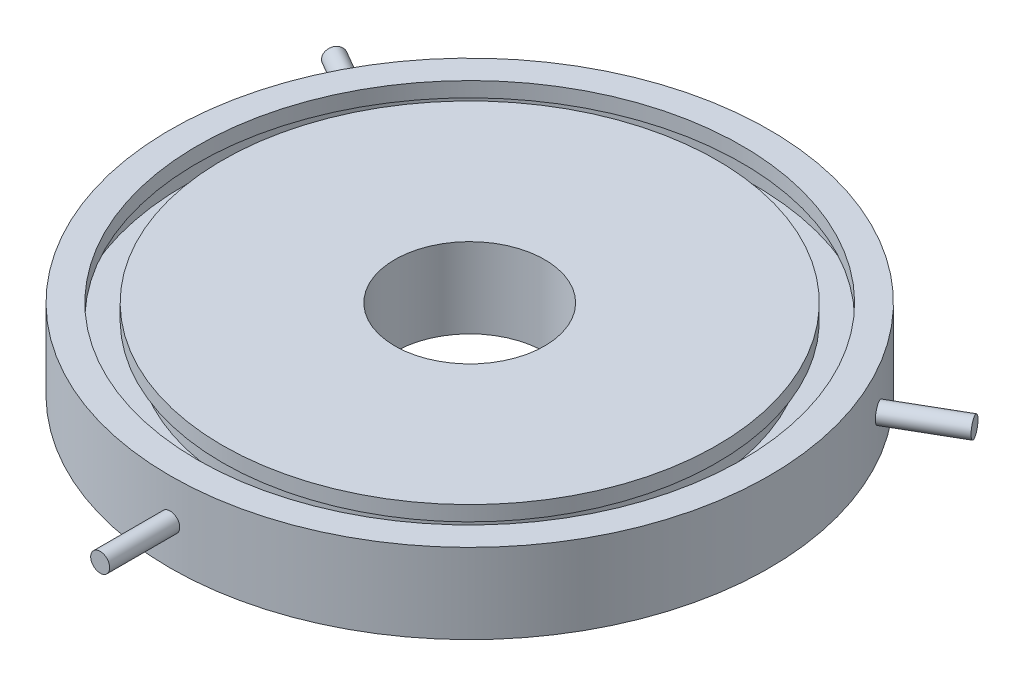
ISO-10303-21;
HEADER;
FILE_DESCRIPTION(('STEP AP214'),'2;1');
FILE_NAME('part.step','',(''),(''),'','','');
FILE_SCHEMA(('AUTOMOTIVE_DESIGN { 1 0 10303 214 1 1 1 1 }'));
ENDSEC;
DATA;
#1=APPLICATION_CONTEXT('core data for automotive mechanical design processes');
#2=APPLICATION_PROTOCOL_DEFINITION('international standard','automotive_design',2000,#1);
#3=PRODUCT_CONTEXT('',#1,'mechanical');
#4=PRODUCT('Part','Part','',(#3));
#5=PRODUCT_RELATED_PRODUCT_CATEGORY('part','',(#4));
#6=PRODUCT_DEFINITION_FORMATION('','',#4);
#7=PRODUCT_DEFINITION_CONTEXT('part definition',#1,'design');
#8=PRODUCT_DEFINITION('design','',#6,#7);
#9=PRODUCT_DEFINITION_SHAPE('','',#8);
#10=(LENGTH_UNIT() NAMED_UNIT(*) SI_UNIT(.MILLI.,.METRE.));
#11=(NAMED_UNIT(*) PLANE_ANGLE_UNIT() SI_UNIT($,.RADIAN.));
#12=(NAMED_UNIT(*) SI_UNIT($,.STERADIAN.) SOLID_ANGLE_UNIT());
#13=UNCERTAINTY_MEASURE_WITH_UNIT(LENGTH_MEASURE(1.E-05),#10,'distance_accuracy_value','');
#14=(GEOMETRIC_REPRESENTATION_CONTEXT(3) GLOBAL_UNCERTAINTY_ASSIGNED_CONTEXT((#13)) GLOBAL_UNIT_ASSIGNED_CONTEXT((#10,
#11,#12)) REPRESENTATION_CONTEXT('',''));
#15=CARTESIAN_POINT('',(0.,0.,0.));
#16=DIRECTION('',(0.,0.,1.));
#17=DIRECTION('',(1.,0.,0.));
#18=AXIS2_PLACEMENT_3D('',#15,#16,#17);
#19=CARTESIAN_POINT('',(-1.09482735377586E-12,4.,-6.34908792207511E-13));
#20=DIRECTION('',(0.,-1.,0.));
#21=DIRECTION('',(0.,0.,-1.));
#22=AXIS2_PLACEMENT_3D('',#19,#20,#21);
#23=CYLINDRICAL_SURFACE('',#22,30.);
#24=CARTESIAN_POINT('',(-1.09482735377586E-12,4.,-6.34908792207511E-13));
#25=DIRECTION('',(0.,1.,0.));
#26=DIRECTION('',(0.,0.,1.));
#27=AXIS2_PLACEMENT_3D('',#24,#25,#26);
#28=CIRCLE('',#27,30.);
#29=CARTESIAN_POINT('',(-1.09482735377586E-12,4.,29.9999999999994));
#30=VERTEX_POINT('',#29);
#31=EDGE_CURVE('E65',#30,#30,#28,.T.);
#32=ORIENTED_EDGE('',*,*,#31,.F.);
#33=EDGE_LOOP('',(#32));
#34=FACE_BOUND('',#33,.T.);
#35=CARTESIAN_POINT('',(-1.09482735377586E-12,-4.,-6.34908792207511E-13));
#36=DIRECTION('',(0.,1.,0.));
#37=DIRECTION('',(0.,0.,1.));
#38=AXIS2_PLACEMENT_3D('',#35,#36,#37);
#39=CIRCLE('',#38,30.);
#40=CARTESIAN_POINT('',(-1.09482735377586E-12,-4.,29.9999999999994));
#41=VERTEX_POINT('',#40);
#42=EDGE_CURVE('E144',#41,#41,#39,.T.);
#43=ORIENTED_EDGE('',*,*,#42,.T.);
#44=EDGE_LOOP('',(#43));
#45=FACE_BOUND('',#44,.T.);
#46=CARTESIAN_POINT('',(-0.95,0.,29.9849545605786));
#47=CARTESIAN_POINT('',(-0.949997638648001,-0.0533475617914222,29.9849547635282));
#48=CARTESIAN_POINT('',(-0.945491291271366,-0.106733465109091,29.9850984594788));
#49=CARTESIAN_POINT('',(-0.927577662957273,-0.212034011387137,29.9856578531794));
#50=CARTESIAN_POINT('',(-0.914159759069934,-0.263946821255327,29.9860738755455));
#51=CARTESIAN_POINT('',(-0.878806261346535,-0.36476046482302,29.9871307482794));
#52=CARTESIAN_POINT('',(-0.856874845689744,-0.413662762374192,29.9877714883475));
#53=CARTESIAN_POINT('',(-0.805122896517256,-0.50707797466031,29.989205457033));
#54=CARTESIAN_POINT('',(-0.775304284731987,-0.551591954995381,29.9899986484924));
#55=CARTESIAN_POINT('',(-0.708607295027484,-0.635002509774153,29.9916485981506));
#56=CARTESIAN_POINT('',(-0.671725971899152,-0.673896728817169,29.9925053827767));
#57=CARTESIAN_POINT('',(-0.591955720063285,-0.744943847642183,29.994185712697));
#58=CARTESIAN_POINT('',(-0.549066551848916,-0.777096478538527,29.9950092566642));
#59=CARTESIAN_POINT('',(-0.458488873293861,-0.833751765511642,29.9965304140593));
#60=CARTESIAN_POINT('',(-0.410799445448349,-0.858252955433277,29.9972280033412));
#61=CARTESIAN_POINT('',(-0.311981505377094,-0.898900338142444,29.9984184028569));
#62=CARTESIAN_POINT('',(-0.260853007724078,-0.915046566330805,29.9989112139584));
#63=CARTESIAN_POINT('',(-0.15662656437145,-0.938520483227959,29.9996363585291));
#64=CARTESIAN_POINT('',(-0.103529290039781,-0.945851150114085,29.9998687799644));
#65=CARTESIAN_POINT('',(0.00314267862065953,-0.951495030277864,30.0000472410445));
#66=CARTESIAN_POINT('',(0.0567173709248461,-0.949808281777499,29.9999932819032));
#67=CARTESIAN_POINT('',(0.162803211517166,-0.937467721948742,29.9996051393655));
#68=CARTESIAN_POINT('',(0.215314734128148,-0.926817124898033,29.9992710564166));
#69=CARTESIAN_POINT('',(0.317804111783429,-0.896856172634715,29.9983604326374));
#70=CARTESIAN_POINT('',(0.367781960932794,-0.877545797274985,29.9977838912429));
#71=CARTESIAN_POINT('',(0.463795641293244,-0.830809754585433,29.99645315443));
#72=CARTESIAN_POINT('',(0.509830755335826,-0.803382614872341,29.9956989267843));
#73=CARTESIAN_POINT('',(0.59664433064176,-0.741192693784049,29.9940978130399));
#74=CARTESIAN_POINT('',(0.6374227782772,-0.706429893391758,29.9932509267008));
#75=CARTESIAN_POINT('',(0.712584209016418,-0.630537247116376,29.9915594934164));
#76=CARTESIAN_POINT('',(0.746964376013532,-0.589404612170377,29.9907149476615));
#77=CARTESIAN_POINT('',(0.808331634526641,-0.501949738898891,29.9891237843852));
#78=CARTESIAN_POINT('',(0.835318724788983,-0.455627499693398,29.9883771668803));
#79=CARTESIAN_POINT('',(0.881133459439344,-0.359106751003055,29.987066073659));
#80=CARTESIAN_POINT('',(0.899961011616263,-0.308908197719455,29.986501600001));
#81=CARTESIAN_POINT('',(0.928920405754191,-0.206060501520758,29.9856185289816));
#82=CARTESIAN_POINT('',(0.939052274093927,-0.153411366040117,29.9852999308744));
#83=CARTESIAN_POINT('',(0.950329235945307,-0.047181530282896,29.984944670167));
#84=CARTESIAN_POINT('',(0.951478231274329,0.00639875540054994,29.9849078851581));
#85=CARTESIAN_POINT('',(0.944767000083418,0.112991455894253,29.9851200790409));
#86=CARTESIAN_POINT('',(0.936906785244056,0.166003871440672,29.9853690575622));
#87=CARTESIAN_POINT('',(0.912403489093211,0.269945104175986,29.9861245999223));
#88=CARTESIAN_POINT('',(0.895762181738932,0.320874339970678,29.9866311117335));
#89=CARTESIAN_POINT('',(0.854170886821983,0.419216367684173,29.9878445780053));
#90=CARTESIAN_POINT('',(0.82922088051705,0.466629151670483,29.988551532918));
#91=CARTESIAN_POINT('',(0.771710376302114,0.556610366370163,29.9900864902041));
#92=CARTESIAN_POINT('',(0.739147250974646,0.599177117076195,29.9909145343303));
#93=CARTESIAN_POINT('',(0.667338714270507,0.678241071916151,29.9925981773452));
#94=CARTESIAN_POINT('',(0.628093284194144,0.714738259064508,29.9934537763109));
#95=CARTESIAN_POINT('',(0.544017460958569,0.780640088192591,29.9950964345316));
#96=CARTESIAN_POINT('',(0.499185094752548,0.810042213700225,29.9958834694052));
#97=CARTESIAN_POINT('',(0.405218091392916,0.860902093238219,29.9972999340259));
#98=CARTESIAN_POINT('',(0.356083464515596,0.882359866243653,29.9979293641496));
#99=CARTESIAN_POINT('',(0.254916172034901,0.916717520708085,29.9989595505673));
#100=CARTESIAN_POINT('',(0.202884060140911,0.929619031226735,29.9993603503891));
#101=CARTESIAN_POINT('',(0.0973909592249703,0.946503276285453,29.9998882691786));
#102=CARTESIAN_POINT('',(0.043929971891341,0.950486021363229,30.0000153884697));
#103=CARTESIAN_POINT('',(-0.062878173261127,0.949419493709473,29.9999816195801));
#104=CARTESIAN_POINT('',(-0.116225370739832,0.944374184154654,29.9998208577748));
#105=CARTESIAN_POINT('',(-0.221315119867083,0.925402919459799,29.9992296881894));
#106=CARTESIAN_POINT('',(-0.273057668346577,0.911476946782345,29.9987992798768));
#107=CARTESIAN_POINT('',(-0.373470761433369,0.875140244864442,29.9977172939162));
#108=CARTESIAN_POINT('',(-0.422141255871736,0.852729377101143,29.9970657126574));
#109=CARTESIAN_POINT('',(-0.515028020214401,0.800060309448905,29.9956147887933));
#110=CARTESIAN_POINT('',(-0.559244449554881,0.769802390588997,29.99481545148));
#111=CARTESIAN_POINT('',(-0.641986398812155,0.70228607460083,29.9931587137742));
#112=CARTESIAN_POINT('',(-0.680510022651851,0.665025354426237,29.9923012941746));
#113=CARTESIAN_POINT('',(-0.750765731540023,0.584554461115251,29.9906250242158));
#114=CARTESIAN_POINT('',(-0.782496133235544,0.541342817695683,29.9898061834554));
#115=CARTESIAN_POINT('',(-0.838270687608649,0.450178697666109,29.9882991126955));
#116=CARTESIAN_POINT('',(-0.862309690214838,0.402223072553795,29.9876109703348));
#117=CARTESIAN_POINT('',(-0.901967120201049,0.30299132581277,29.9864444815894));
#118=CARTESIAN_POINT('',(-0.917595582803928,0.251719243519599,29.9859658853078));
#119=CARTESIAN_POINT('',(-0.93584932489273,0.166769684137786,29.9854003136642));
#120=CARTESIAN_POINT('',(-0.941149144761905,0.133643527227708,29.9852338831807));
#121=CARTESIAN_POINT('',(-0.948225223500484,0.0670166246537693,29.9850109429039));
#122=CARTESIAN_POINT('',(-0.950001483531496,0.0335158791134032,29.9849544330745));
#123=CARTESIAN_POINT('',(-0.95,0.,29.9849545605786));
#124=B_SPLINE_CURVE_WITH_KNOTS('',3,(#46,#47,#48,#49,#50,#51,#52,#53,#54,#55,#56,#57,#58,#59,
#60,#61,#62,#63,#64,#65,#66,#67,#68,#69,#70,#71,#72,#73,#74,#75,#76,#77,#78,#79,#80,#81,#82,#83,
#84,#85,#86,#87,#88,#89,#90,#91,#92,#93,#94,#95,#96,#97,#98,#99,#100,#101,#102,#103,#104,#105,
#106,#107,#108,#109,#110,#111,#112,#113,#114,#115,#116,#117,#118,#119,#120,#121,#122,#123),
.UNSPECIFIED.,.T.,.F.,(4,2,2,2,2,2,2,2,2,2,2,2,2,2,2,2,2,2,2,2,2,2,2,2,2,2,2,2,2,2,2,2,2,2,2,2,
2,2,4),(0.,0.15992034747227,0.320031669693388,0.480064513163523,0.640058400185914,
0.800119151845999,0.960186286253822,1.12028407364004,1.28038118266996,1.44042419059039,
1.6004665201395,1.76045148577615,1.92043682362246,2.08045120066043,2.24046599252746,
2.40055104678368,2.56063612818568,2.72072301866514,2.88080942351249,3.04082628906673,
3.20084294715702,3.36082729103512,3.52081199579869,3.68085199573401,3.84089244353094,
4.00098957121863,4.16108631651208,4.32115257161431,4.48121863759481,4.64121445427888,
4.8012105869216,4.96120933174466,5.12120234727096,5.28124853142352,5.44133432905797,
5.60152709503758,5.76152829727308,5.86199910832147,5.96246988624775),.UNSPECIFIED.);
#125=CARTESIAN_POINT('',(-0.95,0.,29.9849545605786));
#126=VERTEX_POINT('',#125);
#127=EDGE_CURVE('E60',#126,#126,#124,.T.);
#128=ORIENTED_EDGE('',*,*,#127,.F.);
#129=EDGE_LOOP('',(#128));
#130=FACE_BOUND('',#129,.T.);
#131=CARTESIAN_POINT('',(26.442732380783,0.,-14.1697531466942));
#132=CARTESIAN_POINT('',(26.4427313758665,-0.0533475617914221,-14.1697552931598));
#133=CARTESIAN_POINT('',(26.4406026465218,-0.106733465109091,-14.1737297524415));
#134=CARTESIAN_POINT('',(26.4321302815202,-0.212034011387137,-14.1895231064858));
#135=CARTESIAN_POINT('',(26.4257816155141,-0.263946821255326,-14.2013513633008));
#136=CARTESIAN_POINT('',(26.4090201452885,-0.364760464823019,-14.2324968268088));
#137=CARTESIAN_POINT('',(26.3986093346364,-0.41366276237419,-14.2518103599427));
#138=CARTESIAN_POINT('',(26.37397521336,-0.507077974660309,-14.2973458469641));
#139=CARTESIAN_POINT('',(26.3597528314213,-0.551591954995379,-14.3235661180055));
#140=CARTESIAN_POINT('',(26.327833234888,-0.635002509774152,-14.3821523802746));
#141=CARTESIAN_POINT('',(26.3101345705756,-0.673896728817168,-14.414520935342));
#142=CARTESIAN_POINT('',(26.2717046530554,-0.744943847642182,-14.4844441648583));
#143=CARTESIAN_POINT('',(26.250973278945,-0.777096478538527,-14.5219990460627));
#144=CARTESIAN_POINT('',(26.2070018006148,-0.833751765511642,-14.6012021954048));
#145=CARTESIAN_POINT('',(26.1837612167315,-0.858252955433277,-14.6428512460519));
#146=CARTESIAN_POINT('',(26.1353831629171,-0.898900338142443,-14.7290252922611));
#147=CARTESIAN_POINT('',(26.1102457010238,-0.915046566330804,-14.7735502756367));
#148=CARTESIAN_POINT('',(26.0587604729671,-0.938520483227959,-14.8641755956115));
#149=CARTESIAN_POINT('',(26.0324131186686,-0.945851150114084,-14.9102753947721));
#150=CARTESIAN_POINT('',(25.9792316861674,-0.951495030277864,-15.0027452600438));
#151=CARTESIAN_POINT('',(25.9523976100282,-0.949808281777499,-15.0491153250085));
#152=CARTESIAN_POINT('',(25.8990185484341,-0.937467721948742,-15.1407942866744));
#153=CARTESIAN_POINT('',(25.8724734628079,-0.926817124898033,-15.1861035577725));
#154=CARTESIAN_POINT('',(25.8204401506542,-0.896856172634715,-15.2744066505504));
#155=CARTESIAN_POINT('',(25.7949519265855,-0.877545797274985,-15.317400466843));
#156=CARTESIAN_POINT('',(25.7457926345196,-0.830809754585433,-15.3998853847396));
#157=CARTESIAN_POINT('',(25.7221218971969,-0.803382614872342,-15.4393758491437));
#158=CARTESIAN_POINT('',(25.6773285043669,-0.74119269378405,-15.5137580538798));
#159=CARTESIAN_POINT('',(25.6562058554655,-0.706429893391759,-15.5486497822895));
#160=CARTESIAN_POINT('',(25.6171603159027,-0.630537247116377,-15.6128957740522));
#161=CARTESIAN_POINT('',(25.5992388343258,-0.589404612170379,-15.6422475991806));
#162=CARTESIAN_POINT('',(25.5671772172503,-0.501949738898892,-15.6945976223754));
#163=CARTESIAN_POINT('',(25.5530370823931,-0.455627499693399,-15.7175958193644));
#164=CARTESIAN_POINT('',(25.5289942750315,-0.359106751003054,-15.7566169968286));
#165=CARTESIAN_POINT('',(25.5190916504154,-0.308908197719454,-15.7726398984759));
#166=CARTESIAN_POINT('',(25.5038471914103,-0.206060501520758,-15.7972779339678));
#167=CARTESIAN_POINT('',(25.498505343186,-0.153411366040117,-15.8058930902843));
#168=CARTESIAN_POINT('',(25.4925591974628,-0.0471815302828971,-15.8154815953714));
#169=CARTESIAN_POINT('',(25.4919528430461,0.00639875540054882,-15.8164582620107));
#170=CARTESIAN_POINT('',(25.4954922239346,0.112991455894252,-15.8107522622501));
#171=CARTESIAN_POINT('',(25.4996379530787,0.166003871440671,-15.8040696057806));
#172=CARTESIAN_POINT('',(25.5125439200316,0.269945104175986,-15.7832269000176));
#173=CARTESIAN_POINT('',(25.5213032258045,0.320874339970677,-15.7690683610022));
#174=CARTESIAN_POINT('',(25.543149765881,0.419216367684173,-15.7336559761637));
#175=CARTESIAN_POINT('',(25.5562370099472,0.466629151670483,-15.7124021143354));
#176=CARTESIAN_POINT('',(25.5863215740581,0.556610366370163,-15.6633640353439));
#177=CARTESIAN_POINT('',(25.6033202439706,0.599177117076194,-15.6355775636468));
#178=CARTESIAN_POINT('',(25.6406825899445,0.678241071916151,-15.5742313681598));
#179=CARTESIAN_POINT('',(25.6610462754225,0.714738259064508,-15.5406716282141));
#180=CARTESIAN_POINT('',(25.7045067707891,0.780640088192591,-15.4686811585584));
#181=CARTESIAN_POINT('',(25.7276045460863,0.810042213700225,-15.430248707949));
#182=CARTESIAN_POINT('',(25.7758147421112,0.860902093238219,-15.3495791282324));
#183=CARTESIAN_POINT('',(25.8009271580269,0.882359866243653,-15.307342008213));
#184=CARTESIAN_POINT('',(25.8524029718756,0.916717520708085,-15.2202436561015));
#185=CARTESIAN_POINT('',(25.8787661306501,0.929619031226735,-15.1753829252997));
#186=CARTESIAN_POINT('',(25.9319698721909,0.946503276285453,-15.0842871793772));
#187=CARTESIAN_POINT('',(25.9588104543931,0.950486021363229,-15.0380521658804));
#188=CARTESIAN_POINT('',(26.0121852822531,0.949419493709473,-14.9455367144025));
#189=CARTESIAN_POINT('',(26.0387196571851,0.944374184154654,-14.8992563052626));
#190=CARTESIAN_POINT('',(26.0907525638698,0.925402919459799,-14.8079503280483));
#191=CARTESIAN_POINT('',(26.1162510935768,0.911476946782345,-14.7629247624522));
#192=CARTESIAN_POINT('',(26.1655206127918,0.875140244864443,-14.6754234799862));
#193=CARTESIAN_POINT('',(26.1892915740882,0.852729377101145,-14.6329478047584));
#194=CARTESIAN_POINT('',(26.2344784193343,0.800060309448906,-14.5517800452303));
#195=CARTESIAN_POINT('',(26.255894387585,0.769802390588998,-14.5130878255001));
#196=CARTESIAN_POINT('',(26.295830585273,0.70228607460083,-14.4406028266318));
#197=CARTESIAN_POINT('',(26.3143498500379,0.665025354426237,-14.406811679941));
#198=CARTESIAN_POINT('',(26.348026012114,0.58455446111525,-14.3451303163035));
#199=CARTESIAN_POINT('',(26.3631820760617,0.541342817695682,-14.3172415619827));
#200=CARTESIAN_POINT('',(26.3897641916848,0.450178697666108,-14.2681858456309));
#201=CARTESIAN_POINT('',(26.4011877442222,0.402223072553794,-14.247023387512));
#202=CARTESIAN_POINT('',(26.4200062503285,0.30299132581277,-14.2120958013224));
#203=CARTESIAN_POINT('',(26.4274060050919,0.251719243519598,-14.1983218575454));
#204=CARTESIAN_POINT('',(26.4360430767253,0.166769684137786,-14.1822308673606));
#205=CARTESIAN_POINT('',(26.4385488536332,0.133643527227708,-14.1775578734766));
#206=CARTESIAN_POINT('',(26.4418938210593,0.0670166246537693,-14.1713183393914));
#207=CARTESIAN_POINT('',(26.442733012127,0.0335158791134031,-14.1697517981662));
#208=CARTESIAN_POINT('',(26.442732380783,0.,-14.1697531466942));
#209=B_SPLINE_CURVE_WITH_KNOTS('',3,(#131,#132,#133,#134,#135,#136,#137,#138,#139,#140,#141,
#142,#143,#144,#145,#146,#147,#148,#149,#150,#151,#152,#153,#154,#155,#156,#157,#158,#159,#160,
#161,#162,#163,#164,#165,#166,#167,#168,#169,#170,#171,#172,#173,#174,#175,#176,#177,#178,#179,
#180,#181,#182,#183,#184,#185,#186,#187,#188,#189,#190,#191,#192,#193,#194,#195,#196,#197,#198,
#199,#200,#201,#202,#203,#204,#205,#206,#207,#208),.UNSPECIFIED.,.T.,.F.,(4,2,2,2,2,2,2,2,2,2,2,
2,2,2,2,2,2,2,2,2,2,2,2,2,2,2,2,2,2,2,2,2,2,2,2,2,2,2,4),(0.,0.15992034747227,0.320031669693387,
0.48006451316352,0.640058400185914,0.800119151845998,0.96018628625382,1.12028407364004,
1.28038118266996,1.44042419059039,1.6004665201395,1.76045148577615,1.92043682362246,
2.08045120066043,2.24046599252746,2.40055104678368,2.56063612818568,2.72072301866514,
2.88080942351249,3.04082628906673,3.20084294715702,3.36082729103512,3.52081199579869,
3.68085199573401,3.84089244353094,4.00098957121863,4.16108631651208,4.32115257161431,
4.48121863759481,4.64121445427888,4.80121058692159,4.96120933174466,5.12120234727097,
5.28124853142352,5.44133432905797,5.60152709503759,5.76152829727309,5.86199910832148,
5.96246988624775),.UNSPECIFIED.);
#210=CARTESIAN_POINT('',(26.442732380783,0.,-14.1697531466942));
#211=VERTEX_POINT('',#210);
#212=EDGE_CURVE('E55',#211,#211,#209,.T.);
#213=ORIENTED_EDGE('',*,*,#212,.F.);
#214=EDGE_LOOP('',(#213));
#215=FACE_BOUND('',#214,.T.);
#216=CARTESIAN_POINT('',(-25.4927323807849,0.,-15.8152014138852));
#217=CARTESIAN_POINT('',(-25.4927337372204,-0.0533475617914222,-15.8151994703692));
#218=CARTESIAN_POINT('',(-25.4951113552523,-0.106733465109091,-15.811368707038));
#219=CARTESIAN_POINT('',(-25.5045526185648,-0.212034011387137,-15.7961347466944));
#220=CARTESIAN_POINT('',(-25.5116218564461,-0.263946821255327,-15.7847225122455));
#221=CARTESIAN_POINT('',(-25.5302138839439,-0.36476046482302,-15.7546339214713));
#222=CARTESIAN_POINT('',(-25.5417344889486,-0.413662762374193,-15.7359611284057));
#223=CARTESIAN_POINT('',(-25.5688523168447,-0.507077974660312,-15.6918596100697));
#224=CARTESIAN_POINT('',(-25.5844485466912,-0.551591954995381,-15.6664325304877));
#225=CARTESIAN_POINT('',(-25.6192259398624,-0.635002509774153,-15.6094962178768));
#226=CARTESIAN_POINT('',(-25.6384085986784,-0.673896728817169,-15.5779844474355));
#227=CARTESIAN_POINT('',(-25.6797489329939,-0.744943847642183,-15.5097415478395));
#228=CARTESIAN_POINT('',(-25.7019067270979,-0.777096478538528,-15.4730102106023));
#229=CARTESIAN_POINT('',(-25.7485129273228,-0.833751765511643,-15.3953282186554));
#230=CARTESIAN_POINT('',(-25.772961771285,-0.858252955433278,-15.3543767572901));
#231=CARTESIAN_POINT('',(-25.8234016575419,-0.898900338142444,-15.2693931105966));
#232=CARTESIAN_POINT('',(-25.8493926933016,-0.915046566330805,-15.2253609383225));
#233=CARTESIAN_POINT('',(-25.9021339085975,-0.938520483227959,-15.1354607629184));
#234=CARTESIAN_POINT('',(-25.9288838286307,-0.945851150114085,-15.0895933851931));
#235=CARTESIAN_POINT('',(-25.9823743647899,-0.951495030277864,-14.9973019810015));
#236=CARTESIAN_POINT('',(-26.0091149809549,-0.949808281777499,-14.9508779568955));
#237=CARTESIAN_POINT('',(-26.0618217599531,-0.937467721948742,-14.8588108526919));
#238=CARTESIAN_POINT('',(-26.0877881969379,-0.926817124898033,-14.813167498645));
#239=CARTESIAN_POINT('',(-26.1382442624394,-0.896856172634716,-14.7239537820878));
#240=CARTESIAN_POINT('',(-26.1627338875201,-0.877545797274985,-14.6803834244007));
#241=CARTESIAN_POINT('',(-26.2095882758146,-0.830809754585433,-14.5965677696913));
#242=CARTESIAN_POINT('',(-26.2319526525346,-0.803382614872342,-14.5563230776414));
#243=CARTESIAN_POINT('',(-26.2739728350105,-0.741192693784049,-14.4803397591609));
#244=CARTESIAN_POINT('',(-26.2936286337445,-0.706429893391757,-14.4446011444122));
#245=CARTESIAN_POINT('',(-26.329744524921,-0.630537247116374,-14.3786637193651));
#246=CARTESIAN_POINT('',(-26.3462032103411,-0.589404612170376,-14.3484673484818));
#247=CARTESIAN_POINT('',(-26.3755088517788,-0.50194973889889,-14.2945261620106));
#248=CARTESIAN_POINT('',(-26.3883558071839,-0.455627499693398,-14.2707813475168));
#249=CARTESIAN_POINT('',(-26.4101277344727,-0.359106751003054,-14.2304490768313));
#250=CARTESIAN_POINT('',(-26.4190526620335,-0.308908197719454,-14.213861701526));
#251=CARTESIAN_POINT('',(-26.4327675971664,-0.206060501520756,-14.1883405950147));
#252=CARTESIAN_POINT('',(-26.4375576172818,-0.153411366040116,-14.179406840591));
#253=CARTESIAN_POINT('',(-26.4428884334099,-0.0471815302828946,-14.1694630747965));
#254=CARTESIAN_POINT('',(-26.4434310743222,0.00639875540055141,-14.1684496231483));
#255=CARTESIAN_POINT('',(-26.4402592240198,0.112991455894254,-14.1743678167917));
#256=CARTESIAN_POINT('',(-26.4365447383246,0.166003871440673,-14.1812994517825));
#257=CARTESIAN_POINT('',(-26.4249474091266,0.269945104175988,-14.2028976999056));
#258=CARTESIAN_POINT('',(-26.4170654075453,0.320874339970679,-14.2175627507322));
#259=CARTESIAN_POINT('',(-26.3973206527048,0.419216367684175,-14.2541886018424));
#260=CARTESIAN_POINT('',(-26.3854578904661,0.466629151670485,-14.2761494185835));
#261=CARTESIAN_POINT('',(-26.3580319503621,0.556610366370165,-14.3267224548611));
#262=CARTESIAN_POINT('',(-26.3424674949471,0.599177117076196,-14.3553369706844));
#263=CARTESIAN_POINT('',(-26.3080213042168,0.678241071916152,-14.4183668091862));
#264=CARTESIAN_POINT('',(-26.2891395596184,0.714738259064509,-14.4527821480977));
#265=CARTESIAN_POINT('',(-26.2485242317495,0.780640088192591,-14.5264152759741));
#266=CARTESIAN_POINT('',(-26.2267896408406,0.810042213700225,-14.565634761457));
#267=CARTESIAN_POINT('',(-26.181032833506,0.860902093238218,-14.6477208057944));
#268=CARTESIAN_POINT('',(-26.1570106225443,0.882359866243653,-14.6905873559374));
#269=CARTESIAN_POINT('',(-26.1073191439123,0.916717520708085,-14.7787158944667));
#270=CARTESIAN_POINT('',(-26.0816501907929,0.929619031226735,-14.8239774250903));
#271=CARTESIAN_POINT('',(-26.0293608314177,0.946503276285453,-14.9156010898023));
#272=CARTESIAN_POINT('',(-26.0027404262863,0.950486021363229,-14.9619632225901));
#273=CARTESIAN_POINT('',(-25.9493071089938,0.949419493709473,-15.0544449051784));
#274=CARTESIAN_POINT('',(-25.9224942864471,0.944374184154654,-15.1005645525131));
#275=CARTESIAN_POINT('',(-25.8694374440046,0.925402919459798,-15.1912793601419));
#276=CARTESIAN_POINT('',(-25.8431934252321,0.911476946782344,-15.2358745174254));
#277=CARTESIAN_POINT('',(-25.7920498513603,0.875140244864442,-15.3222938139308));
#278=CARTESIAN_POINT('',(-25.7671503182184,0.852729377101142,-15.3641179078998));
#279=CARTESIAN_POINT('',(-25.7194503991218,0.800060309448904,-15.4438347435638));
#280=CARTESIAN_POINT('',(-25.696649938032,0.769802390588996,-15.4817276259807));
#281=CARTESIAN_POINT('',(-25.6538441864627,0.702286074600829,-15.5525558871432));
#282=CARTESIAN_POINT('',(-25.6338398273879,0.665025354426236,-15.5854896142344));
#283=CARTESIAN_POINT('',(-25.5972602805759,0.584554461115249,-15.6454947079131));
#284=CARTESIAN_POINT('',(-25.580685942828,0.541342817695681,-15.6725646214735));
#285=CARTESIAN_POINT('',(-25.5514935040781,0.450178697666107,-15.7201132670654));
#286=CARTESIAN_POINT('',(-25.5388780540092,0.402223072553793,-15.7405875828237));
#287=CARTESIAN_POINT('',(-25.5180391301294,0.302991325812768,-15.7743486802678));
#288=CARTESIAN_POINT('',(-25.5098104222899,0.251719243519596,-15.7876440277632));
#289=CARTESIAN_POINT('',(-25.5001937518345,0.166769684137783,-15.8031694463044));
#290=CARTESIAN_POINT('',(-25.4973997088732,0.133643527227706,-15.8076760097048));
#291=CARTESIAN_POINT('',(-25.4936685975607,0.0670166246537687,-15.8136926035133));
#292=CARTESIAN_POINT('',(-25.4927315285973,0.0335158791134029,-15.8152026349091));
#293=CARTESIAN_POINT('',(-25.4927323807849,0.,-15.8152014138852));
#294=B_SPLINE_CURVE_WITH_KNOTS('',3,(#216,#217,#218,#219,#220,#221,#222,#223,#224,#225,#226,
#227,#228,#229,#230,#231,#232,#233,#234,#235,#236,#237,#238,#239,#240,#241,#242,#243,#244,#245,
#246,#247,#248,#249,#250,#251,#252,#253,#254,#255,#256,#257,#258,#259,#260,#261,#262,#263,#264,
#265,#266,#267,#268,#269,#270,#271,#272,#273,#274,#275,#276,#277,#278,#279,#280,#281,#282,#283,
#284,#285,#286,#287,#288,#289,#290,#291,#292,#293),.UNSPECIFIED.,.T.,.F.,(4,2,2,2,2,2,2,2,2,2,2,
2,2,2,2,2,2,2,2,2,2,2,2,2,2,2,2,2,2,2,2,2,2,2,2,2,2,2,4),(0.,0.15992034747227,0.320031669693388,
0.480064513163525,0.640058400185914,0.800119151846,0.960186286253822,1.12028407364004,
1.28038118266996,1.44042419059039,1.6004665201395,1.76045148577614,1.92043682362246,
2.08045120066043,2.24046599252746,2.40055104678369,2.56063612818568,2.72072301866514,
2.88080942351249,3.04082628906674,3.20084294715702,3.36082729103512,3.52081199579869,
3.68085199573401,3.84089244353094,4.00098957121863,4.16108631651207,4.32115257161431,
4.48121863759481,4.64121445427888,4.8012105869216,4.96120933174466,5.12120234727096,
5.28124853142352,5.44133432905797,5.60152709503759,5.76152829727309,5.86199910832148,
5.96246988624775),.UNSPECIFIED.);
#295=CARTESIAN_POINT('',(-25.4927323807849,0.,-15.8152014138852));
#296=VERTEX_POINT('',#295);
#297=EDGE_CURVE('E10',#296,#296,#294,.T.);
#298=ORIENTED_EDGE('',*,*,#297,.F.);
#299=EDGE_LOOP('',(#298));
#300=FACE_BOUND('',#299,.T.);
#301=ADVANCED_FACE('F43',(#34,#45,#130,#215,#300),#23,.T.);
#302=CARTESIAN_POINT('',(0.,4.,0.));
#303=DIRECTION('',(0.,1.,0.));
#304=DIRECTION('',(0.,0.,1.));
#305=AXIS2_PLACEMENT_3D('',#302,#303,#304);
#306=PLANE('',#305);
#307=CARTESIAN_POINT('',(-1.09482735377586E-12,4.,-6.34908792207511E-13));
#308=DIRECTION('',(0.,1.,0.));
#309=DIRECTION('',(0.,0.,1.));
#310=AXIS2_PLACEMENT_3D('',#307,#308,#309);
#311=CIRCLE('',#310,7.5);
#312=CARTESIAN_POINT('',(-1.09482735377586E-12,4.,7.49999999999936));
#313=VERTEX_POINT('',#312);
#314=EDGE_CURVE('E150',#313,#313,#311,.T.);
#315=ORIENTED_EDGE('',*,*,#314,.F.);
#316=EDGE_LOOP('',(#315));
#317=FACE_BOUND('',#316,.T.);
#318=CARTESIAN_POINT('',(0.,4.,0.));
#319=DIRECTION('',(0.,1.,0.));
#320=DIRECTION('',(0.,0.,1.));
#321=AXIS2_PLACEMENT_3D('',#318,#319,#320);
#322=CIRCLE('',#321,24.7499999999994);
#323=CARTESIAN_POINT('',(0.,4.,24.7499999999994));
#324=VERTEX_POINT('',#323);
#325=EDGE_CURVE('E184',#324,#324,#322,.T.);
#326=ORIENTED_EDGE('',*,*,#325,.T.);
#327=EDGE_LOOP('',(#326));
#328=FACE_BOUND('',#327,.T.);
#329=ADVANCED_FACE('F125',(#317,#328),#306,.T.);
#330=CARTESIAN_POINT('',(-1.09482735377586E-12,4.,-6.34908792207511E-13));
#331=DIRECTION('',(0.,-1.,0.));
#332=DIRECTION('',(0.,0.,-1.));
#333=AXIS2_PLACEMENT_3D('',#330,#331,#332);
#334=CYLINDRICAL_SURFACE('',#333,7.5);
#335=ORIENTED_EDGE('',*,*,#314,.T.);
#336=EDGE_LOOP('',(#335));
#337=FACE_BOUND('',#336,.T.);
#338=CARTESIAN_POINT('',(-1.09482735377586E-12,-4.,-6.34908792207511E-13));
#339=DIRECTION('',(0.,1.,0.));
#340=DIRECTION('',(0.,0.,1.));
#341=AXIS2_PLACEMENT_3D('',#338,#339,#340);
#342=CIRCLE('',#341,7.5);
#343=CARTESIAN_POINT('',(-1.09482735377586E-12,-4.,7.49999999999936));
#344=VERTEX_POINT('',#343);
#345=EDGE_CURVE('E151',#344,#344,#342,.T.);
#346=ORIENTED_EDGE('',*,*,#345,.F.);
#347=EDGE_LOOP('',(#346));
#348=FACE_BOUND('',#347,.T.);
#349=ADVANCED_FACE('F45',(#337,#348),#334,.F.);
#350=CARTESIAN_POINT('',(0.,4.,0.));
#351=DIRECTION('',(0.,1.,0.));
#352=DIRECTION('',(0.,0.,1.));
#353=AXIS2_PLACEMENT_3D('',#350,#351,#352);
#354=CIRCLE('',#353,27.2499999999994);
#355=CARTESIAN_POINT('',(0.,4.,27.2499999999994));
#356=VERTEX_POINT('',#355);
#357=EDGE_CURVE('E180',#356,#356,#354,.T.);
#358=ORIENTED_EDGE('',*,*,#357,.F.);
#359=EDGE_LOOP('',(#358));
#360=FACE_BOUND('',#359,.T.);
#361=ORIENTED_EDGE('',*,*,#31,.T.);
#362=EDGE_LOOP('',(#361));
#363=FACE_BOUND('',#362,.T.);
#364=ADVANCED_FACE('F122',(#360,#363),#306,.T.);
#365=CARTESIAN_POINT('',(0.,-4.,0.));
#366=DIRECTION('',(0.,1.,0.));
#367=DIRECTION('',(0.,0.,1.));
#368=AXIS2_PLACEMENT_3D('',#365,#366,#367);
#369=PLANE('',#368);
#370=ORIENTED_EDGE('',*,*,#345,.T.);
#371=EDGE_LOOP('',(#370));
#372=FACE_BOUND('',#371,.T.);
#373=ORIENTED_EDGE('',*,*,#42,.F.);
#374=EDGE_LOOP('',(#373));
#375=FACE_BOUND('',#374,.T.);
#376=ADVANCED_FACE('F120',(#372,#375),#369,.F.);
#377=CARTESIAN_POINT('',(0.,2.5,24.7499999999994));
#378=DIRECTION('',(0.,-1.,0.));
#379=DIRECTION('',(0.,0.,-1.));
#380=AXIS2_PLACEMENT_3D('',#377,#378,#379);
#381=PLANE('',#380);
#382=CARTESIAN_POINT('',(0.,2.5,0.));
#383=DIRECTION('',(0.,1.,0.));
#384=DIRECTION('',(0.,0.,1.));
#385=AXIS2_PLACEMENT_3D('',#382,#383,#384);
#386=CIRCLE('',#385,23.4999999999994);
#387=CARTESIAN_POINT('',(0.,2.5,23.4999999999994));
#388=VERTEX_POINT('',#387);
#389=EDGE_CURVE('E156',#388,#388,#386,.T.);
#390=ORIENTED_EDGE('',*,*,#389,.T.);
#391=EDGE_LOOP('',(#390));
#392=FACE_BOUND('',#391,.T.);
#393=CARTESIAN_POINT('',(0.,2.5,0.));
#394=DIRECTION('',(0.,1.,0.));
#395=DIRECTION('',(0.,0.,1.));
#396=AXIS2_PLACEMENT_3D('',#393,#394,#395);
#397=CIRCLE('',#396,24.7499999999994);
#398=CARTESIAN_POINT('',(0.,2.5,24.7499999999994));
#399=VERTEX_POINT('',#398);
#400=EDGE_CURVE('E188',#399,#399,#397,.T.);
#401=ORIENTED_EDGE('',*,*,#400,.F.);
#402=EDGE_LOOP('',(#401));
#403=FACE_BOUND('',#402,.T.);
#404=ADVANCED_FACE('F116',(#392,#403),#381,.T.);
#405=CARTESIAN_POINT('',(0.,8.26002697619901,0.));
#406=DIRECTION('',(0.,1.,0.));
#407=DIRECTION('',(0.,0.,1.));
#408=AXIS2_PLACEMENT_3D('',#405,#406,#407);
#409=CYLINDRICAL_SURFACE('',#408,23.4999999999994);
#410=CARTESIAN_POINT('',(0.,-0.0399999999999984,0.));
#411=DIRECTION('',(0.,1.,0.));
#412=DIRECTION('',(0.,0.,1.));
#413=AXIS2_PLACEMENT_3D('',#410,#411,#412);
#414=CIRCLE('',#413,23.4999999999994);
#415=CARTESIAN_POINT('',(0.,-0.0400000000000012,23.4999999999994));
#416=VERTEX_POINT('',#415);
#417=EDGE_CURVE('E164',#416,#416,#414,.T.);
#418=ORIENTED_EDGE('',*,*,#417,.T.);
#419=EDGE_LOOP('',(#418));
#420=FACE_BOUND('',#419,.T.);
#421=ORIENTED_EDGE('',*,*,#389,.F.);
#422=EDGE_LOOP('',(#421));
#423=FACE_BOUND('',#422,.T.);
#424=ADVANCED_FACE('F112',(#420,#423),#409,.T.);
#425=CARTESIAN_POINT('',(0.,-0.0400000000000018,28.4999999999994));
#426=DIRECTION('',(0.,-1.,0.));
#427=DIRECTION('',(0.,0.,-1.));
#428=AXIS2_PLACEMENT_3D('',#425,#426,#427);
#429=PLANE('',#428);
#430=ORIENTED_EDGE('',*,*,#417,.F.);
#431=EDGE_LOOP('',(#430));
#432=FACE_BOUND('',#431,.T.);
#433=CARTESIAN_POINT('',(0.,-0.0399999999999984,0.));
#434=DIRECTION('',(0.,1.,0.));
#435=DIRECTION('',(0.,0.,1.));
#436=AXIS2_PLACEMENT_3D('',#433,#434,#435);
#437=CIRCLE('',#436,28.4999999999994);
#438=CARTESIAN_POINT('',(0.,-0.0400000000000019,28.4999999999994));
#439=VERTEX_POINT('',#438);
#440=EDGE_CURVE('E168',#439,#439,#437,.T.);
#441=ORIENTED_EDGE('',*,*,#440,.T.);
#442=EDGE_LOOP('',(#441));
#443=FACE_BOUND('',#442,.T.);
#444=ADVANCED_FACE('F108',(#432,#443),#429,.F.);
#445=CARTESIAN_POINT('',(0.,8.26002697619901,0.));
#446=DIRECTION('',(0.,1.,0.));
#447=DIRECTION('',(0.,0.,1.));
#448=AXIS2_PLACEMENT_3D('',#445,#446,#447);
#449=CYLINDRICAL_SURFACE('',#448,28.4999999999994);
#450=ORIENTED_EDGE('',*,*,#440,.F.);
#451=EDGE_LOOP('',(#450));
#452=FACE_BOUND('',#451,.T.);
#453=CARTESIAN_POINT('',(0.,2.5,0.));
#454=DIRECTION('',(0.,1.,0.));
#455=DIRECTION('',(0.,0.,1.));
#456=AXIS2_PLACEMENT_3D('',#453,#454,#455);
#457=CIRCLE('',#456,28.4999999999994);
#458=CARTESIAN_POINT('',(0.,2.5,28.4999999999994));
#459=VERTEX_POINT('',#458);
#460=EDGE_CURVE('E172',#459,#459,#457,.T.);
#461=ORIENTED_EDGE('',*,*,#460,.T.);
#462=EDGE_LOOP('',(#461));
#463=FACE_BOUND('',#462,.T.);
#464=ADVANCED_FACE('F104',(#452,#463),#449,.F.);
#465=CARTESIAN_POINT('',(0.,2.5,27.2499999999994));
#466=DIRECTION('',(0.,1.,0.));
#467=DIRECTION('',(0.,0.,1.));
#468=AXIS2_PLACEMENT_3D('',#465,#466,#467);
#469=PLANE('',#468);
#470=ORIENTED_EDGE('',*,*,#460,.F.);
#471=EDGE_LOOP('',(#470));
#472=FACE_BOUND('',#471,.T.);
#473=CARTESIAN_POINT('',(0.,2.5,0.));
#474=DIRECTION('',(0.,1.,0.));
#475=DIRECTION('',(0.,0.,1.));
#476=AXIS2_PLACEMENT_3D('',#473,#474,#475);
#477=CIRCLE('',#476,27.2499999999994);
#478=CARTESIAN_POINT('',(0.,2.5,27.2499999999994));
#479=VERTEX_POINT('',#478);
#480=EDGE_CURVE('E176',#479,#479,#477,.T.);
#481=ORIENTED_EDGE('',*,*,#480,.T.);
#482=EDGE_LOOP('',(#481));
#483=FACE_BOUND('',#482,.T.);
#484=ADVANCED_FACE('F100',(#472,#483),#469,.F.);
#485=CARTESIAN_POINT('',(0.,8.26002697619901,0.));
#486=DIRECTION('',(0.,1.,0.));
#487=DIRECTION('',(0.,0.,1.));
#488=AXIS2_PLACEMENT_3D('',#485,#486,#487);
#489=CYLINDRICAL_SURFACE('',#488,27.2499999999994);
#490=ORIENTED_EDGE('',*,*,#480,.F.);
#491=EDGE_LOOP('',(#490));
#492=FACE_BOUND('',#491,.T.);
#493=ORIENTED_EDGE('',*,*,#357,.T.);
#494=EDGE_LOOP('',(#493));
#495=FACE_BOUND('',#494,.T.);
#496=ADVANCED_FACE('F96',(#492,#495),#489,.F.);
#497=CARTESIAN_POINT('',(0.,8.26002697619901,0.));
#498=DIRECTION('',(0.,1.,0.));
#499=DIRECTION('',(0.,0.,1.));
#500=AXIS2_PLACEMENT_3D('',#497,#498,#499);
#501=CYLINDRICAL_SURFACE('',#500,24.7499999999994);
#502=ORIENTED_EDGE('',*,*,#400,.T.);
#503=EDGE_LOOP('',(#502));
#504=FACE_BOUND('',#503,.T.);
#505=ORIENTED_EDGE('',*,*,#325,.F.);
#506=EDGE_LOOP('',(#505));
#507=FACE_BOUND('',#506,.T.);
#508=ADVANCED_FACE('F92',(#504,#507),#501,.T.);
#509=CARTESIAN_POINT('',(0.,0.,37.));
#510=DIRECTION('',(0.,0.,-1.));
#511=DIRECTION('',(-1.,0.,0.));
#512=AXIS2_PLACEMENT_3D('',#509,#510,#511);
#513=CYLINDRICAL_SURFACE('',#512,0.95);
#514=CARTESIAN_POINT('',(0.,0.,37.));
#515=DIRECTION('',(0.,0.,1.));
#516=DIRECTION('',(1.,0.,0.));
#517=AXIS2_PLACEMENT_3D('',#514,#515,#516);
#518=CIRCLE('',#517,0.95);
#519=CARTESIAN_POINT('',(0.95,0.,37.));
#520=VERTEX_POINT('',#519);
#521=EDGE_CURVE('E192',#520,#520,#518,.T.);
#522=ORIENTED_EDGE('',*,*,#521,.F.);
#523=EDGE_LOOP('',(#522));
#524=FACE_BOUND('',#523,.T.);
#525=ORIENTED_EDGE('',*,*,#127,.T.);
#526=EDGE_LOOP('',(#525));
#527=FACE_BOUND('',#526,.T.);
#528=ADVANCED_FACE('F87',(#524,#527),#513,.T.);
#529=CARTESIAN_POINT('',(0.,0.,37.));
#530=DIRECTION('',(0.,0.,1.));
#531=DIRECTION('',(1.,0.,0.));
#532=AXIS2_PLACEMENT_3D('',#529,#530,#531);
#533=PLANE('',#532);
#534=ORIENTED_EDGE('',*,*,#521,.T.);
#535=EDGE_LOOP('',(#534));
#536=FACE_BOUND('',#535,.T.);
#537=ADVANCED_FACE('F84',(#536),#533,.T.);
#538=CARTESIAN_POINT('',(32.0429399400241,0.,-18.5000000000001));
#539=DIRECTION('',(-0.866025403784436,0.,0.500000000000004));
#540=DIRECTION('',(0.500000000000004,0.,0.866025403784436));
#541=AXIS2_PLACEMENT_3D('',#538,#539,#540);
#542=CYLINDRICAL_SURFACE('',#541,0.95);
#543=CARTESIAN_POINT('',(32.0429399400241,0.,-18.5000000000001));
#544=DIRECTION('',(0.866025403784436,0.,-0.500000000000004));
#545=DIRECTION('',(-0.500000000000004,0.,-0.866025403784436));
#546=AXIS2_PLACEMENT_3D('',#543,#544,#545);
#547=CIRCLE('',#546,0.95);
#548=CARTESIAN_POINT('',(31.5679399400241,0.,-19.3227241335954));
#549=VERTEX_POINT('',#548);
#550=EDGE_CURVE('E196',#549,#549,#547,.T.);
#551=ORIENTED_EDGE('',*,*,#550,.F.);
#552=EDGE_LOOP('',(#551));
#553=FACE_BOUND('',#552,.T.);
#554=ORIENTED_EDGE('',*,*,#212,.T.);
#555=EDGE_LOOP('',(#554));
#556=FACE_BOUND('',#555,.T.);
#557=ADVANCED_FACE('F78',(#553,#556),#542,.T.);
#558=CARTESIAN_POINT('',(32.0429399400241,0.,-18.5000000000001));
#559=DIRECTION('',(0.866025403784436,0.,-0.500000000000004));
#560=DIRECTION('',(-0.500000000000004,0.,-0.866025403784436));
#561=AXIS2_PLACEMENT_3D('',#558,#559,#560);
#562=PLANE('',#561);
#563=ORIENTED_EDGE('',*,*,#550,.T.);
#564=EDGE_LOOP('',(#563));
#565=FACE_BOUND('',#564,.T.);
#566=ADVANCED_FACE('F83',(#565),#562,.T.);
#567=CARTESIAN_POINT('',(-32.0429399400244,0.,-18.4999999999997));
#568=DIRECTION('',(0.866025403784443,0.,0.499999999999992));
#569=DIRECTION('',(0.499999999999992,0.,-0.866025403784443));
#570=AXIS2_PLACEMENT_3D('',#567,#568,#569);
#571=CYLINDRICAL_SURFACE('',#570,0.95);
#572=CARTESIAN_POINT('',(-32.0429399400244,0.,-18.4999999999997));
#573=DIRECTION('',(-0.866025403784443,0.,-0.499999999999992));
#574=DIRECTION('',(-0.499999999999992,0.,0.866025403784443));
#575=AXIS2_PLACEMENT_3D('',#572,#573,#574);
#576=CIRCLE('',#575,0.95);
#577=CARTESIAN_POINT('',(-32.5179399400244,0.,-17.6772758664045));
#578=VERTEX_POINT('',#577);
#579=EDGE_CURVE('E200',#578,#578,#576,.T.);
#580=ORIENTED_EDGE('',*,*,#579,.F.);
#581=EDGE_LOOP('',(#580));
#582=FACE_BOUND('',#581,.T.);
#583=ORIENTED_EDGE('',*,*,#297,.T.);
#584=EDGE_LOOP('',(#583));
#585=FACE_BOUND('',#584,.T.);
#586=ADVANCED_FACE('F207',(#582,#585),#571,.T.);
#587=CARTESIAN_POINT('',(-32.0429399400244,0.,-18.4999999999997));
#588=DIRECTION('',(-0.866025403784443,0.,-0.499999999999992));
#589=DIRECTION('',(-0.499999999999992,0.,0.866025403784443));
#590=AXIS2_PLACEMENT_3D('',#587,#588,#589);
#591=PLANE('',#590);
#592=ORIENTED_EDGE('',*,*,#579,.T.);
#593=EDGE_LOOP('',(#592));
#594=FACE_BOUND('',#593,.T.);
#595=ADVANCED_FACE('F205',(#594),#591,.T.);
#596=CLOSED_SHELL('',(#301,#329,#349,#364,#376,#404,#424,#444,#464,#484,#496,#508,#528,#537,
#557,#566,#586,#595));
#597=MANIFOLD_SOLID_BREP('B2',#596);
#598=ADVANCED_BREP_SHAPE_REPRESENTATION('',(#18,#597),#14);
#599=SHAPE_DEFINITION_REPRESENTATION(#9,#598);
ENDSEC;
END-ISO-10303-21;
